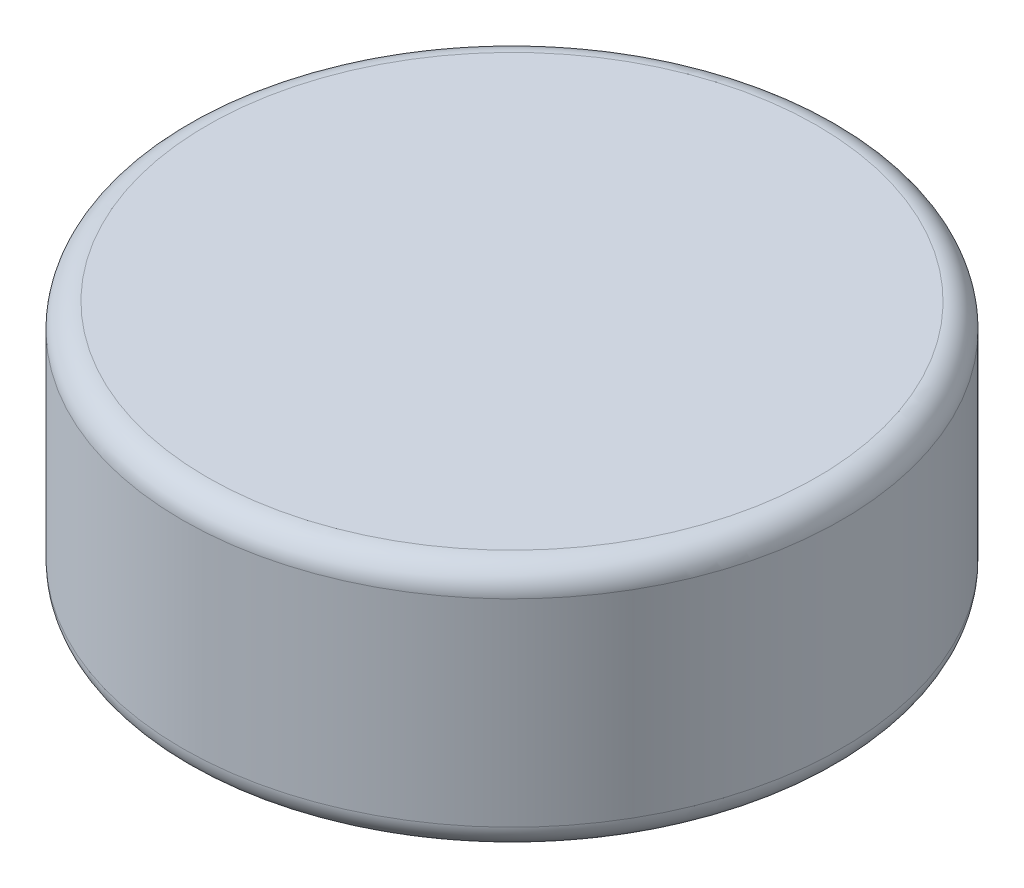
ISO-10303-21;
HEADER;
FILE_DESCRIPTION(('STEP AP214'),'2;1');
FILE_NAME('part.step','',(''),(''),'','','');
FILE_SCHEMA(('AUTOMOTIVE_DESIGN { 1 0 10303 214 1 1 1 1 }'));
ENDSEC;
DATA;
#1=APPLICATION_CONTEXT('core data for automotive mechanical design processes');
#2=APPLICATION_PROTOCOL_DEFINITION('international standard','automotive_design',2000,#1);
#3=PRODUCT_CONTEXT('',#1,'mechanical');
#4=PRODUCT('Part','Part','',(#3));
#5=PRODUCT_RELATED_PRODUCT_CATEGORY('part','',(#4));
#6=PRODUCT_DEFINITION_FORMATION('','',#4);
#7=PRODUCT_DEFINITION_CONTEXT('part definition',#1,'design');
#8=PRODUCT_DEFINITION('design','',#6,#7);
#9=PRODUCT_DEFINITION_SHAPE('','',#8);
#10=(LENGTH_UNIT() NAMED_UNIT(*) SI_UNIT(.MILLI.,.METRE.));
#11=(NAMED_UNIT(*) PLANE_ANGLE_UNIT() SI_UNIT($,.RADIAN.));
#12=(NAMED_UNIT(*) SI_UNIT($,.STERADIAN.) SOLID_ANGLE_UNIT());
#13=UNCERTAINTY_MEASURE_WITH_UNIT(LENGTH_MEASURE(1.E-05),#10,'distance_accuracy_value','');
#14=(GEOMETRIC_REPRESENTATION_CONTEXT(3) GLOBAL_UNCERTAINTY_ASSIGNED_CONTEXT((#13)) GLOBAL_UNIT_ASSIGNED_CONTEXT((#10,
#11,#12)) REPRESENTATION_CONTEXT('',''));
#15=CARTESIAN_POINT('',(0.,0.,0.));
#16=DIRECTION('',(0.,0.,1.));
#17=DIRECTION('',(1.,0.,0.));
#18=AXIS2_PLACEMENT_3D('',#15,#16,#17);
#19=CARTESIAN_POINT('',(0.,2.38125,0.));
#20=DIRECTION('',(0.,-1.,0.));
#21=DIRECTION('',(0.,0.,-1.));
#22=AXIS2_PLACEMENT_3D('',#19,#20,#21);
#23=CYLINDRICAL_SURFACE('',#22,6.35);
#24=CARTESIAN_POINT('',(0.,-1.905,0.));
#25=DIRECTION('',(0.,1.,0.));
#26=DIRECTION('',(0.,0.,1.));
#27=AXIS2_PLACEMENT_3D('',#24,#25,#26);
#28=CIRCLE('',#27,6.35);
#29=CARTESIAN_POINT('',(0.,-1.905,-6.35));
#30=VERTEX_POINT('',#29);
#31=EDGE_CURVE('E41',#30,#30,#28,.T.);
#32=CARTESIAN_POINT('',(0.,1.905,0.));
#33=DIRECTION('',(0.,1.,0.));
#34=DIRECTION('',(0.,0.,1.));
#35=AXIS2_PLACEMENT_3D('',#32,#33,#34);
#36=CIRCLE('',#35,6.35);
#37=CARTESIAN_POINT('',(0.,1.905,-6.35));
#38=VERTEX_POINT('',#37);
#39=EDGE_CURVE('E45',#38,#38,#36,.F.);
#40=CARTESIAN_POINT('',(0.,-1.905,-6.35));
#41=CARTESIAN_POINT('',(0.,-1.8653125,-6.35));
#42=CARTESIAN_POINT('',(0.,-1.825625,-6.35));
#43=CARTESIAN_POINT('',(0.,-1.74625,-6.35));
#44=CARTESIAN_POINT('',(0.,-1.7065625,-6.35));
#45=CARTESIAN_POINT('',(0.,-1.6271875,-6.35));
#46=CARTESIAN_POINT('',(0.,-1.5875,-6.35));
#47=CARTESIAN_POINT('',(0.,-1.508125,-6.35));
#48=CARTESIAN_POINT('',(0.,-1.4684375,-6.35));
#49=CARTESIAN_POINT('',(0.,-1.3890625,-6.35));
#50=CARTESIAN_POINT('',(0.,-1.349375,-6.35));
#51=CARTESIAN_POINT('',(0.,-1.27,-6.35));
#52=CARTESIAN_POINT('',(0.,-1.2303125,-6.35));
#53=CARTESIAN_POINT('',(0.,-1.1509375,-6.35));
#54=CARTESIAN_POINT('',(0.,-1.11125,-6.35));
#55=CARTESIAN_POINT('',(0.,-1.031875,-6.35));
#56=CARTESIAN_POINT('',(0.,-0.992187500000001,-6.35));
#57=CARTESIAN_POINT('',(0.,-0.912812500000001,-6.35));
#58=CARTESIAN_POINT('',(0.,-0.873125000000001,-6.35));
#59=CARTESIAN_POINT('',(0.,-0.793750000000001,-6.35));
#60=CARTESIAN_POINT('',(0.,-0.754062500000001,-6.35));
#61=CARTESIAN_POINT('',(0.,-0.674687500000001,-6.35));
#62=CARTESIAN_POINT('',(0.,-0.635000000000001,-6.35));
#63=CARTESIAN_POINT('',(0.,-0.555625000000001,-6.35));
#64=CARTESIAN_POINT('',(0.,-0.515937500000001,-6.35));
#65=CARTESIAN_POINT('',(0.,-0.436562500000001,-6.35));
#66=CARTESIAN_POINT('',(0.,-0.396875000000001,-6.35));
#67=CARTESIAN_POINT('',(0.,-0.317500000000001,-6.35));
#68=CARTESIAN_POINT('',(0.,-0.277812500000001,-6.35));
#69=CARTESIAN_POINT('',(0.,-0.1984375,-6.35));
#70=CARTESIAN_POINT('',(0.,-0.15875,-6.35));
#71=CARTESIAN_POINT('',(0.,-0.0793750000000003,-6.35));
#72=CARTESIAN_POINT('',(0.,-0.0396875000000004,-6.35));
#73=CARTESIAN_POINT('',(0.,0.0396874999999997,-6.35));
#74=CARTESIAN_POINT('',(0.,0.0793749999999997,-6.35));
#75=CARTESIAN_POINT('',(0.,0.15875,-6.35));
#76=CARTESIAN_POINT('',(0.,0.1984375,-6.35));
#77=CARTESIAN_POINT('',(0.,0.2778125,-6.35));
#78=CARTESIAN_POINT('',(0.,0.3175,-6.35));
#79=CARTESIAN_POINT('',(0.,0.396875,-6.35));
#80=CARTESIAN_POINT('',(0.,0.4365625,-6.35));
#81=CARTESIAN_POINT('',(0.,0.5159375,-6.35));
#82=CARTESIAN_POINT('',(0.,0.555625,-6.35));
#83=CARTESIAN_POINT('',(0.,0.635,-6.35));
#84=CARTESIAN_POINT('',(0.,0.6746875,-6.35));
#85=CARTESIAN_POINT('',(0.,0.7540625,-6.35));
#86=CARTESIAN_POINT('',(0.,0.79375,-6.35));
#87=CARTESIAN_POINT('',(0.,0.873125,-6.35));
#88=CARTESIAN_POINT('',(0.,0.9128125,-6.35));
#89=CARTESIAN_POINT('',(0.,0.9921875,-6.35));
#90=CARTESIAN_POINT('',(0.,1.031875,-6.35));
#91=CARTESIAN_POINT('',(0.,1.11125,-6.35));
#92=CARTESIAN_POINT('',(0.,1.1509375,-6.35));
#93=CARTESIAN_POINT('',(0.,1.2303125,-6.35));
#94=CARTESIAN_POINT('',(0.,1.27,-6.35));
#95=CARTESIAN_POINT('',(0.,1.349375,-6.35));
#96=CARTESIAN_POINT('',(0.,1.3890625,-6.35));
#97=CARTESIAN_POINT('',(0.,1.4684375,-6.35));
#98=CARTESIAN_POINT('',(0.,1.508125,-6.35));
#99=CARTESIAN_POINT('',(0.,1.5875,-6.35));
#100=CARTESIAN_POINT('',(0.,1.6271875,-6.35));
#101=CARTESIAN_POINT('',(0.,1.7065625,-6.35));
#102=CARTESIAN_POINT('',(0.,1.74625,-6.35));
#103=CARTESIAN_POINT('',(0.,1.825625,-6.35));
#104=CARTESIAN_POINT('',(0.,1.8653125,-6.35));
#105=CARTESIAN_POINT('',(0.,1.905,-6.35));
#106=B_SPLINE_CURVE_WITH_KNOTS('',3,(#40,#41,#42,#43,#44,#45,#46,#47,#48,#49,#50,#51,#52,#53,
#54,#55,#56,#57,#58,#59,#60,#61,#62,#63,#64,#65,#66,#67,#68,#69,#70,#71,#72,#73,#74,#75,#76,#77,
#78,#79,#80,#81,#82,#83,#84,#85,#86,#87,#88,#89,#90,#91,#92,#93,#94,#95,#96,#97,#98,#99,#100,
#101,#102,#103,#104,#105),.UNSPECIFIED.,.F.,.F.,(4,2,2,2,2,2,2,2,2,2,2,2,2,2,2,2,2,2,2,2,2,2,2,
2,2,2,2,2,2,2,2,2,4),(0.,0.1190625,0.238125,0.3571875,0.47625,0.5953125,0.714375,0.8334375,
0.9525,1.0715625,1.190625,1.3096875,1.42875,1.5478125,1.666875,1.7859375,1.905,2.0240625,
2.143125,2.2621875,2.38125,2.5003125,2.619375,2.7384375,2.8575,2.9765625,3.095625,3.2146875,
3.33375,3.4528125,3.571875,3.6909375,3.81),.UNSPECIFIED.);
#107=EDGE_CURVE('BSEAM30',#30,#38,#106,.T.);
#108=ORIENTED_EDGE('',*,*,#31,.T.);
#109=ORIENTED_EDGE('',*,*,#39,.T.);
#110=ORIENTED_EDGE('',*,*,#107,.T.);
#111=ORIENTED_EDGE('',*,*,#107,.F.);
#112=EDGE_LOOP('',(#108,#110,#109,#111));
#113=FACE_BOUND('',#112,.T.);
#114=ADVANCED_FACE('F30',(#113),#23,.T.);
#115=CARTESIAN_POINT('',(0.,2.38125,0.));
#116=DIRECTION('',(0.,1.,0.));
#117=DIRECTION('',(0.,0.,1.));
#118=AXIS2_PLACEMENT_3D('',#115,#116,#117);
#119=PLANE('',#118);
#120=CARTESIAN_POINT('',(0.,2.38125,0.));
#121=DIRECTION('',(0.,1.,0.));
#122=DIRECTION('',(0.,0.,1.));
#123=AXIS2_PLACEMENT_3D('',#120,#121,#122);
#124=CIRCLE('',#123,5.87375);
#125=CARTESIAN_POINT('',(0.,2.38125,5.87375));
#126=VERTEX_POINT('',#125);
#127=EDGE_CURVE('E10',#126,#126,#124,.T.);
#128=ORIENTED_EDGE('',*,*,#127,.T.);
#129=EDGE_LOOP('',(#128));
#130=FACE_BOUND('',#129,.T.);
#131=ADVANCED_FACE('F61',(#130),#119,.T.);
#132=CARTESIAN_POINT('',(0.,-2.38125,0.));
#133=DIRECTION('',(0.,1.,0.));
#134=DIRECTION('',(0.,0.,1.));
#135=AXIS2_PLACEMENT_3D('',#132,#133,#134);
#136=PLANE('',#135);
#137=CARTESIAN_POINT('',(0.,-2.38125,0.));
#138=DIRECTION('',(0.,1.,0.));
#139=DIRECTION('',(0.,0.,1.));
#140=AXIS2_PLACEMENT_3D('',#137,#138,#139);
#141=CIRCLE('',#140,5.87375);
#142=CARTESIAN_POINT('',(0.,-2.38125,5.87375));
#143=VERTEX_POINT('',#142);
#144=EDGE_CURVE('E37',#143,#143,#141,.F.);
#145=ORIENTED_EDGE('',*,*,#144,.T.);
#146=EDGE_LOOP('',(#145));
#147=FACE_BOUND('',#146,.T.);
#148=ADVANCED_FACE('F58',(#147),#136,.F.);
#149=CARTESIAN_POINT('',(0.,-1.905,0.));
#150=DIRECTION('',(0.,1.,0.));
#151=DIRECTION('',(0.,0.,1.));
#152=AXIS2_PLACEMENT_3D('',#149,#150,#151);
#153=TOROIDAL_SURFACE('',#152,5.87375,0.47625);
#154=ORIENTED_EDGE('',*,*,#144,.F.);
#155=EDGE_LOOP('',(#154));
#156=FACE_BOUND('',#155,.T.);
#157=ORIENTED_EDGE('',*,*,#31,.F.);
#158=EDGE_LOOP('',(#157));
#159=FACE_BOUND('',#158,.T.);
#160=ADVANCED_FACE('F54',(#156,#159),#153,.T.);
#161=CARTESIAN_POINT('',(0.,1.905,0.));
#162=DIRECTION('',(0.,1.,0.));
#163=DIRECTION('',(0.,0.,1.));
#164=AXIS2_PLACEMENT_3D('',#161,#162,#163);
#165=TOROIDAL_SURFACE('',#164,5.87375,0.47625);
#166=ORIENTED_EDGE('',*,*,#39,.F.);
#167=EDGE_LOOP('',(#166));
#168=FACE_BOUND('',#167,.T.);
#169=ORIENTED_EDGE('',*,*,#127,.F.);
#170=EDGE_LOOP('',(#169));
#171=FACE_BOUND('',#170,.T.);
#172=ADVANCED_FACE('F32',(#168,#171),#165,.T.);
#173=CLOSED_SHELL('',(#114,#131,#148,#160,#172));
#174=MANIFOLD_SOLID_BREP('B2',#173);
#175=ADVANCED_BREP_SHAPE_REPRESENTATION('',(#18,#174),#14);
#176=SHAPE_DEFINITION_REPRESENTATION(#9,#175);
ENDSEC;
END-ISO-10303-21;
